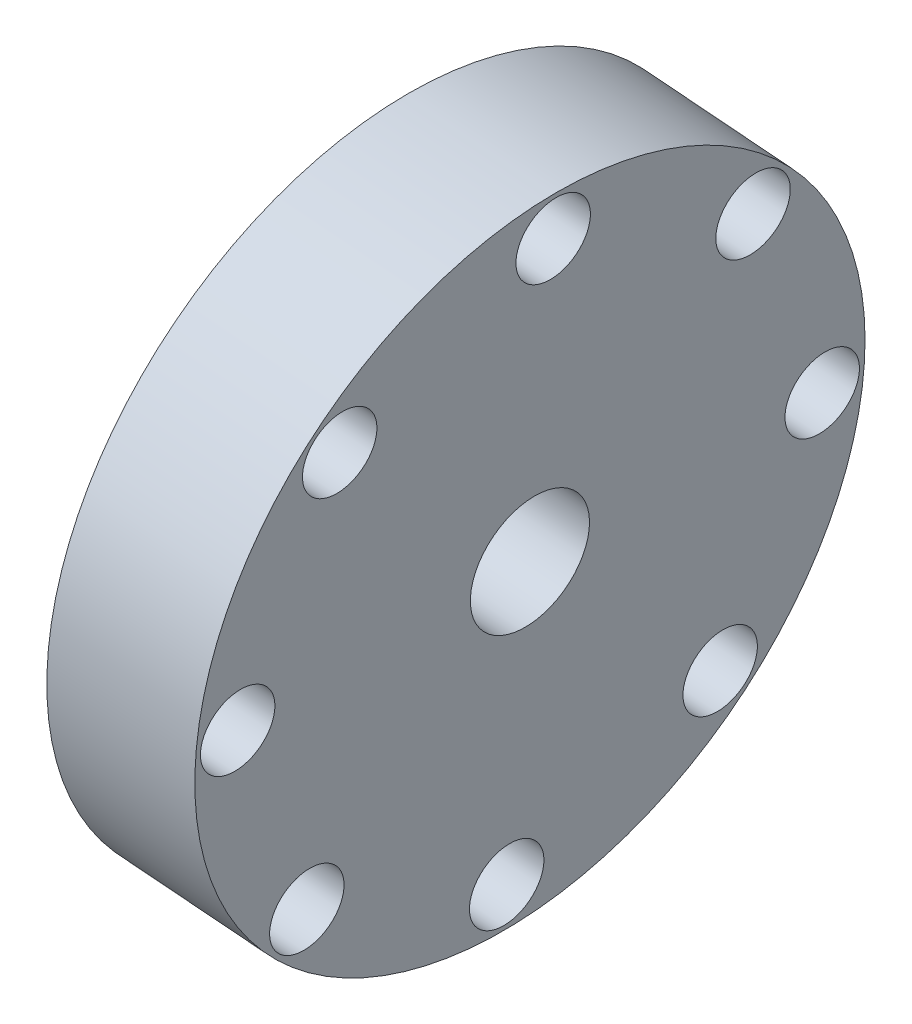
ISO-10303-21;
HEADER;
FILE_DESCRIPTION(('STEP AP214'),'2;1');
FILE_NAME('part.step','',(''),(''),'','','');
FILE_SCHEMA(('AUTOMOTIVE_DESIGN { 1 0 10303 214 1 1 1 1 }'));
ENDSEC;
DATA;
#1=APPLICATION_CONTEXT('core data for automotive mechanical design processes');
#2=APPLICATION_PROTOCOL_DEFINITION('international standard','automotive_design',2000,#1);
#3=PRODUCT_CONTEXT('',#1,'mechanical');
#4=PRODUCT('Part','Part','',(#3));
#5=PRODUCT_RELATED_PRODUCT_CATEGORY('part','',(#4));
#6=PRODUCT_DEFINITION_FORMATION('','',#4);
#7=PRODUCT_DEFINITION_CONTEXT('part definition',#1,'design');
#8=PRODUCT_DEFINITION('design','',#6,#7);
#9=PRODUCT_DEFINITION_SHAPE('','',#8);
#10=(LENGTH_UNIT() NAMED_UNIT(*) SI_UNIT(.MILLI.,.METRE.));
#11=(NAMED_UNIT(*) PLANE_ANGLE_UNIT() SI_UNIT($,.RADIAN.));
#12=(NAMED_UNIT(*) SI_UNIT($,.STERADIAN.) SOLID_ANGLE_UNIT());
#13=UNCERTAINTY_MEASURE_WITH_UNIT(LENGTH_MEASURE(1.E-05),#10,'distance_accuracy_value','');
#14=(GEOMETRIC_REPRESENTATION_CONTEXT(3) GLOBAL_UNCERTAINTY_ASSIGNED_CONTEXT((#13)) GLOBAL_UNIT_ASSIGNED_CONTEXT((#10,
#11,#12)) REPRESENTATION_CONTEXT('',''));
#15=CARTESIAN_POINT('',(0.,0.,0.));
#16=DIRECTION('',(0.,0.,1.));
#17=DIRECTION('',(1.,0.,0.));
#18=AXIS2_PLACEMENT_3D('',#15,#16,#17);
#19=CARTESIAN_POINT('',(228.628910451384,-9.66080811612064,43.174261814343));
#20=DIRECTION('',(0.996833274877087,-0.0795199477981641,0.));
#21=DIRECTION('',(0.0795199477981641,0.996833274877087,0.));
#22=AXIS2_PLACEMENT_3D('',#19,#20,#21);
#23=CYLINDRICAL_SURFACE('',#22,14.2875);
#24=CARTESIAN_POINT('',(228.628910451384,-9.66080811612064,43.174261814343));
#25=DIRECTION('',(0.996833274877087,-0.0795199477981641,0.));
#26=DIRECTION('',(0.0795199477981641,0.996833274877087,0.));
#27=AXIS2_PLACEMENT_3D('',#24,#25,#26);
#28=CIRCLE('',#27,14.2875);
#29=CARTESIAN_POINT('',(229.76505170555,4.58144729868575,43.174261814343));
#30=VERTEX_POINT('',#29);
#31=EDGE_CURVE('E10',#30,#30,#28,.T.);
#32=ORIENTED_EDGE('',*,*,#31,.T.);
#33=EDGE_LOOP('',(#32));
#34=FACE_BOUND('',#33,.T.);
#35=CARTESIAN_POINT('',(234.958801746853,-10.165759784639,43.174261814343));
#36=DIRECTION('',(0.996833274877087,-0.0795199477981641,0.));
#37=DIRECTION('',(0.0795199477981641,0.996833274877087,0.));
#38=AXIS2_PLACEMENT_3D('',#35,#36,#37);
#39=CIRCLE('',#38,14.2875);
#40=CARTESIAN_POINT('',(236.094943001019,4.0764956301674,43.174261814343));
#41=VERTEX_POINT('',#40);
#42=EDGE_CURVE('E37',#41,#41,#39,.T.);
#43=ORIENTED_EDGE('',*,*,#42,.F.);
#44=EDGE_LOOP('',(#43));
#45=FACE_BOUND('',#44,.T.);
#46=ADVANCED_FACE('F30',(#34,#45),#23,.T.);
#47=CARTESIAN_POINT('',(228.628910451384,-9.66080811612064,43.174261814343));
#48=DIRECTION('',(0.996833274877087,-0.0795199477981641,0.));
#49=DIRECTION('',(0.0795199477981641,0.996833274877087,0.));
#50=AXIS2_PLACEMENT_3D('',#47,#48,#49);
#51=PLANE('',#50);
#52=CARTESIAN_POINT('',(228.628910451384,-9.66080811612098,30.6742618143433));
#53=DIRECTION('',(-0.996833274877087,0.0795199477981641,0.));
#54=DIRECTION('',(-0.0795199477981641,-0.996833274877087,0.));
#55=AXIS2_PLACEMENT_3D('',#52,#53,#54);
#56=CIRCLE('',#55,1.5875);
#57=CARTESIAN_POINT('',(228.502672534254,-11.2432809399884,30.6742618143433));
#58=VERTEX_POINT('',#57);
#59=EDGE_CURVE('E52',#58,#58,#56,.T.);
#60=ORIENTED_EDGE('',*,*,#59,.F.);
#61=EDGE_LOOP('',(#60));
#62=FACE_BOUND('',#61,.T.);
#63=CARTESIAN_POINT('',(229.33177413048,-0.849963511396112,34.3354270495113));
#64=DIRECTION('',(-0.996833274877087,0.0795199477981641,0.));
#65=DIRECTION('',(-0.0795199477981641,-0.996833274877087,0.));
#66=AXIS2_PLACEMENT_3D('',#63,#64,#65);
#67=CIRCLE('',#66,1.5875);
#68=CARTESIAN_POINT('',(229.20553621335,-2.43243633526349,34.3354270495113));
#69=VERTEX_POINT('',#68);
#70=EDGE_CURVE('E93',#69,#69,#67,.T.);
#71=ORIENTED_EDGE('',*,*,#70,.F.);
#72=EDGE_LOOP('',(#71));
#73=FACE_BOUND('',#72,.T.);
#74=CARTESIAN_POINT('',(227.926046772288,-18.4716527208456,34.3354270495117));
#75=DIRECTION('',(-0.996833274877087,0.0795199477981641,0.));
#76=DIRECTION('',(-0.0795199477981641,-0.996833274877087,0.));
#77=AXIS2_PLACEMENT_3D('',#74,#75,#76);
#78=CIRCLE('',#77,1.5875);
#79=CARTESIAN_POINT('',(227.799808855158,-20.054125544713,34.3354270495117));
#80=VERTEX_POINT('',#79);
#81=EDGE_CURVE('E96',#80,#80,#78,.T.);
#82=ORIENTED_EDGE('',*,*,#81,.F.);
#83=EDGE_LOOP('',(#82));
#84=FACE_BOUND('',#83,.T.);
#85=CARTESIAN_POINT('',(227.634911103907,-22.1212240520842,43.1742618143437));
#86=DIRECTION('',(-0.996833274877087,0.0795199477981641,0.));
#87=DIRECTION('',(-0.0795199477981641,-0.996833274877087,0.));
#88=AXIS2_PLACEMENT_3D('',#85,#86,#87);
#89=CIRCLE('',#88,1.5875);
#90=CARTESIAN_POINT('',(227.508673186777,-23.7036968759516,43.1742618143437));
#91=VERTEX_POINT('',#90);
#92=EDGE_CURVE('E84',#91,#91,#89,.T.);
#93=ORIENTED_EDGE('',*,*,#92,.F.);
#94=EDGE_LOOP('',(#93));
#95=FACE_BOUND('',#94,.T.);
#96=CARTESIAN_POINT('',(227.926046772288,-18.4716527208452,52.0130965791754));
#97=DIRECTION('',(-0.996833274877087,0.0795199477981641,0.));
#98=DIRECTION('',(-0.0795199477981641,-0.996833274877087,0.));
#99=AXIS2_PLACEMENT_3D('',#96,#97,#98);
#100=CIRCLE('',#99,1.5875);
#101=CARTESIAN_POINT('',(227.799808855158,-20.0541255447125,52.0130965791754));
#102=VERTEX_POINT('',#101);
#103=EDGE_CURVE('E80',#102,#102,#100,.T.);
#104=ORIENTED_EDGE('',*,*,#103,.F.);
#105=EDGE_LOOP('',(#104));
#106=FACE_BOUND('',#105,.T.);
#107=CARTESIAN_POINT('',(228.628910451384,-9.6608081161203,55.6742618143433));
#108=DIRECTION('',(-0.996833274877087,0.0795199477981641,0.));
#109=DIRECTION('',(-0.0795199477981641,-0.996833274877087,0.));
#110=AXIS2_PLACEMENT_3D('',#107,#108,#109);
#111=CIRCLE('',#110,1.5875);
#112=CARTESIAN_POINT('',(228.502672534254,-11.2432809399877,55.6742618143433));
#113=VERTEX_POINT('',#112);
#114=EDGE_CURVE('E83',#113,#113,#111,.T.);
#115=ORIENTED_EDGE('',*,*,#114,.F.);
#116=EDGE_LOOP('',(#115));
#117=FACE_BOUND('',#116,.T.);
#118=CARTESIAN_POINT('',(229.33177413048,-0.849963511395627,52.0130965791749));
#119=DIRECTION('',(-0.996833274877087,0.0795199477981641,0.));
#120=DIRECTION('',(-0.0795199477981641,-0.996833274877087,0.));
#121=AXIS2_PLACEMENT_3D('',#118,#119,#120);
#122=CIRCLE('',#121,1.5875);
#123=CARTESIAN_POINT('',(229.20553621335,-2.432436335263,52.0130965791749));
#124=VERTEX_POINT('',#123);
#125=EDGE_CURVE('E87',#124,#124,#122,.T.);
#126=ORIENTED_EDGE('',*,*,#125,.F.);
#127=EDGE_LOOP('',(#126));
#128=FACE_BOUND('',#127,.T.);
#129=CARTESIAN_POINT('',(229.622909798861,2.79960781984294,43.174261814343));
#130=DIRECTION('',(-0.996833274877087,0.0795199477981641,0.));
#131=DIRECTION('',(-0.0795199477981641,-0.996833274877087,0.));
#132=AXIS2_PLACEMENT_3D('',#129,#130,#131);
#133=CIRCLE('',#132,1.5875);
#134=CARTESIAN_POINT('',(229.496671881731,1.21713499597557,43.174261814343));
#135=VERTEX_POINT('',#134);
#136=EDGE_CURVE('E90',#135,#135,#133,.T.);
#137=ORIENTED_EDGE('',*,*,#136,.F.);
#138=EDGE_LOOP('',(#137));
#139=FACE_BOUND('',#138,.T.);
#140=ORIENTED_EDGE('',*,*,#31,.F.);
#141=EDGE_LOOP('',(#140));
#142=FACE_BOUND('',#141,.T.);
#143=ADVANCED_FACE('F106',(#62,#73,#84,#95,#106,#117,#128,#139,#142),#51,.F.);
#144=CARTESIAN_POINT('',(234.958801746853,-10.165759784639,43.174261814343));
#145=DIRECTION('',(0.996833274877087,-0.0795199477981641,0.));
#146=DIRECTION('',(0.0795199477981641,0.996833274877087,0.));
#147=AXIS2_PLACEMENT_3D('',#144,#145,#146);
#148=PLANE('',#147);
#149=CARTESIAN_POINT('',(234.958801746853,-10.1657597846393,30.6742618143433));
#150=DIRECTION('',(0.996833274877087,-0.0795199477981641,0.));
#151=DIRECTION('',(0.0795199477981641,0.996833274877087,0.));
#152=AXIS2_PLACEMENT_3D('',#149,#150,#151);
#153=CIRCLE('',#152,1.5875);
#154=CARTESIAN_POINT('',(235.085039663983,-8.58328696077195,30.6742618143433));
#155=VERTEX_POINT('',#154);
#156=EDGE_CURVE('E33',#155,#155,#153,.T.);
#157=ORIENTED_EDGE('',*,*,#156,.F.);
#158=EDGE_LOOP('',(#157));
#159=FACE_BOUND('',#158,.T.);
#160=CARTESIAN_POINT('',(235.661665425949,-1.35491517991445,34.3354270495113));
#161=DIRECTION('',(0.996833274877087,-0.0795199477981641,0.));
#162=DIRECTION('',(0.0795199477981641,0.996833274877087,0.));
#163=AXIS2_PLACEMENT_3D('',#160,#161,#162);
#164=CIRCLE('',#163,1.5875);
#165=CARTESIAN_POINT('',(235.787903343079,0.227557643952923,34.3354270495113));
#166=VERTEX_POINT('',#165);
#167=EDGE_CURVE('E66',#166,#166,#164,.T.);
#168=ORIENTED_EDGE('',*,*,#167,.F.);
#169=EDGE_LOOP('',(#168));
#170=FACE_BOUND('',#169,.T.);
#171=CARTESIAN_POINT('',(234.255938067757,-18.976604389364,34.3354270495117));
#172=DIRECTION('',(0.996833274877087,-0.0795199477981641,0.));
#173=DIRECTION('',(0.0795199477981641,0.996833274877087,0.));
#174=AXIS2_PLACEMENT_3D('',#171,#172,#173);
#175=CIRCLE('',#174,1.5875);
#176=CARTESIAN_POINT('',(234.382175984887,-17.3941315654966,34.3354270495117));
#177=VERTEX_POINT('',#176);
#178=EDGE_CURVE('E64',#177,#177,#175,.T.);
#179=ORIENTED_EDGE('',*,*,#178,.F.);
#180=EDGE_LOOP('',(#179));
#181=FACE_BOUND('',#180,.T.);
#182=CARTESIAN_POINT('',(233.964802399376,-22.6261757206026,43.1742618143437));
#183=DIRECTION('',(0.996833274877087,-0.0795199477981641,0.));
#184=DIRECTION('',(0.0795199477981641,0.996833274877087,0.));
#185=AXIS2_PLACEMENT_3D('',#182,#183,#184);
#186=CIRCLE('',#185,1.5875);
#187=CARTESIAN_POINT('',(234.091040316506,-21.0437028967352,43.1742618143437));
#188=VERTEX_POINT('',#187);
#189=EDGE_CURVE('E61',#188,#188,#186,.T.);
#190=ORIENTED_EDGE('',*,*,#189,.F.);
#191=EDGE_LOOP('',(#190));
#192=FACE_BOUND('',#191,.T.);
#193=CARTESIAN_POINT('',(234.255938067757,-18.9766043893635,52.0130965791754));
#194=DIRECTION('',(0.996833274877087,-0.0795199477981641,0.));
#195=DIRECTION('',(0.0795199477981641,0.996833274877087,0.));
#196=AXIS2_PLACEMENT_3D('',#193,#194,#195);
#197=CIRCLE('',#196,1.5875);
#198=CARTESIAN_POINT('',(234.382175984887,-17.3941315654961,52.0130965791754));
#199=VERTEX_POINT('',#198);
#200=EDGE_CURVE('E58',#199,#199,#197,.T.);
#201=ORIENTED_EDGE('',*,*,#200,.F.);
#202=EDGE_LOOP('',(#201));
#203=FACE_BOUND('',#202,.T.);
#204=CARTESIAN_POINT('',(234.958801746853,-10.1657597846386,55.6742618143433));
#205=DIRECTION('',(0.996833274877087,-0.0795199477981641,0.));
#206=DIRECTION('',(0.0795199477981641,0.996833274877087,0.));
#207=AXIS2_PLACEMENT_3D('',#204,#205,#206);
#208=CIRCLE('',#207,1.5875);
#209=CARTESIAN_POINT('',(235.085039663983,-8.58328696077126,55.6742618143433));
#210=VERTEX_POINT('',#209);
#211=EDGE_CURVE('E55',#210,#210,#208,.T.);
#212=ORIENTED_EDGE('',*,*,#211,.F.);
#213=EDGE_LOOP('',(#212));
#214=FACE_BOUND('',#213,.T.);
#215=CARTESIAN_POINT('',(235.661665425949,-1.35491517991396,52.0130965791749));
#216=DIRECTION('',(0.996833274877087,-0.0795199477981641,0.));
#217=DIRECTION('',(0.0795199477981641,0.996833274877087,0.));
#218=AXIS2_PLACEMENT_3D('',#215,#216,#217);
#219=CIRCLE('',#218,1.5875);
#220=CARTESIAN_POINT('',(235.787903343079,0.227557643953409,52.0130965791749));
#221=VERTEX_POINT('',#220);
#222=EDGE_CURVE('E51',#221,#221,#219,.T.);
#223=ORIENTED_EDGE('',*,*,#222,.F.);
#224=EDGE_LOOP('',(#223));
#225=FACE_BOUND('',#224,.T.);
#226=CARTESIAN_POINT('',(235.95280109433,2.29465615132461,43.174261814343));
#227=DIRECTION('',(0.996833274877087,-0.0795199477981641,0.));
#228=DIRECTION('',(0.0795199477981641,0.996833274877087,0.));
#229=AXIS2_PLACEMENT_3D('',#226,#227,#228);
#230=CIRCLE('',#229,1.5875);
#231=CARTESIAN_POINT('',(236.07903901146,3.87712897519198,43.174261814343));
#232=VERTEX_POINT('',#231);
#233=EDGE_CURVE('E48',#232,#232,#230,.T.);
#234=ORIENTED_EDGE('',*,*,#233,.F.);
#235=EDGE_LOOP('',(#234));
#236=FACE_BOUND('',#235,.T.);
#237=CARTESIAN_POINT('',(234.958801746853,-10.165759784639,43.174261814343));
#238=DIRECTION('',(0.996833274877087,-0.0795199477981641,0.));
#239=DIRECTION('',(0.0795199477981641,0.996833274877087,0.));
#240=AXIS2_PLACEMENT_3D('',#237,#238,#239);
#241=CIRCLE('',#240,2.54);
#242=CARTESIAN_POINT('',(235.16078241426,-7.63380326645118,43.174261814343));
#243=VERTEX_POINT('',#242);
#244=EDGE_CURVE('E45',#243,#243,#241,.T.);
#245=ORIENTED_EDGE('',*,*,#244,.F.);
#246=EDGE_LOOP('',(#245));
#247=FACE_BOUND('',#246,.T.);
#248=ORIENTED_EDGE('',*,*,#42,.T.);
#249=EDGE_LOOP('',(#248));
#250=FACE_BOUND('',#249,.T.);
#251=ADVANCED_FACE('F109',(#159,#170,#181,#192,#203,#214,#225,#236,#247,#250),#148,.T.);
#252=CARTESIAN_POINT('',(229.894888710477,-9.76179844982431,43.174261814343));
#253=DIRECTION('',(0.996833274877087,-0.0795199477981641,0.));
#254=DIRECTION('',(0.0795199477981641,0.996833274877087,0.));
#255=AXIS2_PLACEMENT_3D('',#252,#253,#254);
#256=CYLINDRICAL_SURFACE('',#255,2.54);
#257=CARTESIAN_POINT('',(229.894888710477,-9.76179844982431,43.174261814343));
#258=DIRECTION('',(0.996833274877087,-0.0795199477981641,0.));
#259=DIRECTION('',(0.0795199477981641,0.996833274877087,0.));
#260=AXIS2_PLACEMENT_3D('',#257,#258,#259);
#261=CIRCLE('',#260,2.54);
#262=CARTESIAN_POINT('',(230.096869377885,-7.22984193163651,43.174261814343));
#263=VERTEX_POINT('',#262);
#264=EDGE_CURVE('E42',#263,#263,#261,.T.);
#265=ORIENTED_EDGE('',*,*,#264,.F.);
#266=EDGE_LOOP('',(#265));
#267=FACE_BOUND('',#266,.T.);
#268=ORIENTED_EDGE('',*,*,#244,.T.);
#269=EDGE_LOOP('',(#268));
#270=FACE_BOUND('',#269,.T.);
#271=ADVANCED_FACE('F139',(#267,#270),#256,.F.);
#272=CARTESIAN_POINT('',(229.894888710477,-9.76179844982431,43.174261814343));
#273=DIRECTION('',(0.996833274877087,-0.0795199477981641,0.));
#274=DIRECTION('',(0.0795199477981641,0.996833274877087,0.));
#275=AXIS2_PLACEMENT_3D('',#272,#273,#274);
#276=PLANE('',#275);
#277=ORIENTED_EDGE('',*,*,#264,.T.);
#278=EDGE_LOOP('',(#277));
#279=FACE_BOUND('',#278,.T.);
#280=ADVANCED_FACE('F129',(#279),#276,.T.);
#281=CARTESIAN_POINT('',(239.591242547632,2.0044083418613,43.174261814343));
#282=DIRECTION('',(-0.996833274877087,0.0795199477981641,0.));
#283=DIRECTION('',(-0.0795199477981641,-0.996833274877087,0.));
#284=AXIS2_PLACEMENT_3D('',#281,#282,#283);
#285=CYLINDRICAL_SURFACE('',#284,1.5875);
#286=ORIENTED_EDGE('',*,*,#233,.T.);
#287=EDGE_LOOP('',(#286));
#288=FACE_BOUND('',#287,.T.);
#289=ORIENTED_EDGE('',*,*,#136,.T.);
#290=EDGE_LOOP('',(#289));
#291=FACE_BOUND('',#290,.T.);
#292=ADVANCED_FACE('F126',(#288,#291),#285,.F.);
#293=CARTESIAN_POINT('',(239.30010687925,-1.64516298937727,52.0130965791749));
#294=DIRECTION('',(-0.996833274877087,0.0795199477981641,0.));
#295=DIRECTION('',(-0.0795199477981641,-0.996833274877087,0.));
#296=AXIS2_PLACEMENT_3D('',#293,#294,#295);
#297=CYLINDRICAL_SURFACE('',#296,1.5875);
#298=ORIENTED_EDGE('',*,*,#222,.T.);
#299=EDGE_LOOP('',(#298));
#300=FACE_BOUND('',#299,.T.);
#301=ORIENTED_EDGE('',*,*,#125,.T.);
#302=EDGE_LOOP('',(#301));
#303=FACE_BOUND('',#302,.T.);
#304=ADVANCED_FACE('F128',(#300,#303),#297,.F.);
#305=CARTESIAN_POINT('',(238.597243200154,-10.4560075941019,55.6742618143433));
#306=DIRECTION('',(-0.996833274877087,0.0795199477981641,0.));
#307=DIRECTION('',(-0.0795199477981641,-0.996833274877087,0.));
#308=AXIS2_PLACEMENT_3D('',#305,#306,#307);
#309=CYLINDRICAL_SURFACE('',#308,1.5875);
#310=ORIENTED_EDGE('',*,*,#211,.T.);
#311=EDGE_LOOP('',(#310));
#312=FACE_BOUND('',#311,.T.);
#313=ORIENTED_EDGE('',*,*,#114,.T.);
#314=EDGE_LOOP('',(#313));
#315=FACE_BOUND('',#314,.T.);
#316=ADVANCED_FACE('F136',(#312,#315),#309,.F.);
#317=CARTESIAN_POINT('',(237.894379521058,-19.2668521988268,52.0130965791754));
#318=DIRECTION('',(-0.996833274877087,0.0795199477981641,0.));
#319=DIRECTION('',(-0.0795199477981641,-0.996833274877087,0.));
#320=AXIS2_PLACEMENT_3D('',#317,#318,#319);
#321=CYLINDRICAL_SURFACE('',#320,1.5875);
#322=ORIENTED_EDGE('',*,*,#200,.T.);
#323=EDGE_LOOP('',(#322));
#324=FACE_BOUND('',#323,.T.);
#325=ORIENTED_EDGE('',*,*,#103,.T.);
#326=EDGE_LOOP('',(#325));
#327=FACE_BOUND('',#326,.T.);
#328=ADVANCED_FACE('F157',(#324,#327),#321,.F.);
#329=CARTESIAN_POINT('',(237.603243852677,-22.9164235300659,43.1742618143437));
#330=DIRECTION('',(-0.996833274877087,0.0795199477981641,0.));
#331=DIRECTION('',(-0.0795199477981641,-0.996833274877087,0.));
#332=AXIS2_PLACEMENT_3D('',#329,#330,#331);
#333=CYLINDRICAL_SURFACE('',#332,1.5875);
#334=ORIENTED_EDGE('',*,*,#189,.T.);
#335=EDGE_LOOP('',(#334));
#336=FACE_BOUND('',#335,.T.);
#337=ORIENTED_EDGE('',*,*,#92,.T.);
#338=EDGE_LOOP('',(#337));
#339=FACE_BOUND('',#338,.T.);
#340=ADVANCED_FACE('F160',(#336,#339),#333,.F.);
#341=CARTESIAN_POINT('',(237.894379521058,-19.2668521988273,34.3354270495117));
#342=DIRECTION('',(-0.996833274877087,0.0795199477981641,0.));
#343=DIRECTION('',(-0.0795199477981641,-0.996833274877087,0.));
#344=AXIS2_PLACEMENT_3D('',#341,#342,#343);
#345=CYLINDRICAL_SURFACE('',#344,1.5875);
#346=ORIENTED_EDGE('',*,*,#178,.T.);
#347=EDGE_LOOP('',(#346));
#348=FACE_BOUND('',#347,.T.);
#349=ORIENTED_EDGE('',*,*,#81,.T.);
#350=EDGE_LOOP('',(#349));
#351=FACE_BOUND('',#350,.T.);
#352=ADVANCED_FACE('F187',(#348,#351),#345,.F.);
#353=CARTESIAN_POINT('',(239.30010687925,-1.64516298937775,34.3354270495113));
#354=DIRECTION('',(-0.996833274877087,0.0795199477981641,0.));
#355=DIRECTION('',(-0.0795199477981641,-0.996833274877087,0.));
#356=AXIS2_PLACEMENT_3D('',#353,#354,#355);
#357=CYLINDRICAL_SURFACE('',#356,1.5875);
#358=ORIENTED_EDGE('',*,*,#167,.T.);
#359=EDGE_LOOP('',(#358));
#360=FACE_BOUND('',#359,.T.);
#361=ORIENTED_EDGE('',*,*,#70,.T.);
#362=EDGE_LOOP('',(#361));
#363=FACE_BOUND('',#362,.T.);
#364=ADVANCED_FACE('F195',(#360,#363),#357,.F.);
#365=CARTESIAN_POINT('',(238.597243200154,-10.4560075941026,30.6742618143433));
#366=DIRECTION('',(-0.996833274877087,0.0795199477981641,0.));
#367=DIRECTION('',(-0.0795199477981641,-0.996833274877087,0.));
#368=AXIS2_PLACEMENT_3D('',#365,#366,#367);
#369=CYLINDRICAL_SURFACE('',#368,1.5875);
#370=ORIENTED_EDGE('',*,*,#156,.T.);
#371=EDGE_LOOP('',(#370));
#372=FACE_BOUND('',#371,.T.);
#373=ORIENTED_EDGE('',*,*,#59,.T.);
#374=EDGE_LOOP('',(#373));
#375=FACE_BOUND('',#374,.T.);
#376=ADVANCED_FACE('F104',(#372,#375),#369,.F.);
#377=CLOSED_SHELL('',(#46,#143,#251,#271,#280,#292,#304,#316,#328,#340,#352,#364,#376));
#378=MANIFOLD_SOLID_BREP('B2',#377);
#379=ADVANCED_BREP_SHAPE_REPRESENTATION('',(#18,#378),#14);
#380=SHAPE_DEFINITION_REPRESENTATION(#9,#379);
ENDSEC;
END-ISO-10303-21;
